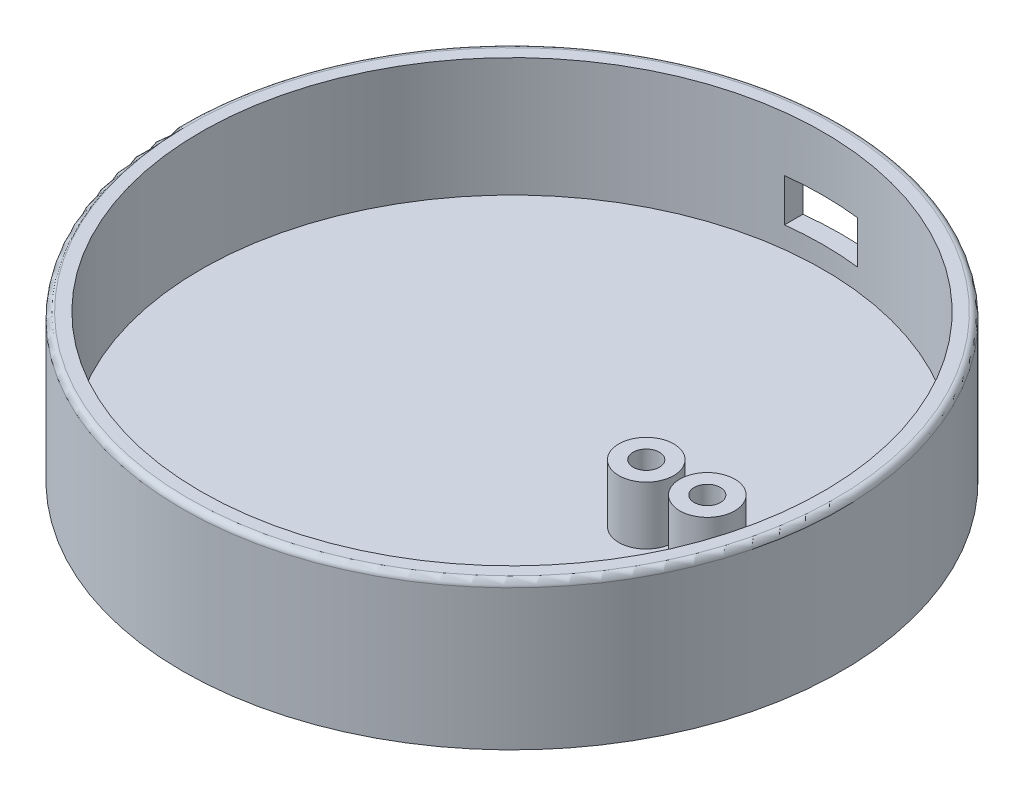
ISO-10303-21;
HEADER;
FILE_DESCRIPTION(('STEP AP214'),'2;1');
FILE_NAME('part.step','',(''),(''),'','','');
FILE_SCHEMA(('AUTOMOTIVE_DESIGN { 1 0 10303 214 1 1 1 1 }'));
ENDSEC;
DATA;
#1=APPLICATION_CONTEXT('core data for automotive mechanical design processes');
#2=APPLICATION_PROTOCOL_DEFINITION('international standard','automotive_design',2000,#1);
#3=PRODUCT_CONTEXT('',#1,'mechanical');
#4=PRODUCT('Part','Part','',(#3));
#5=PRODUCT_RELATED_PRODUCT_CATEGORY('part','',(#4));
#6=PRODUCT_DEFINITION_FORMATION('','',#4);
#7=PRODUCT_DEFINITION_CONTEXT('part definition',#1,'design');
#8=PRODUCT_DEFINITION('design','',#6,#7);
#9=PRODUCT_DEFINITION_SHAPE('','',#8);
#10=(LENGTH_UNIT() NAMED_UNIT(*) SI_UNIT(.MILLI.,.METRE.));
#11=(NAMED_UNIT(*) PLANE_ANGLE_UNIT() SI_UNIT($,.RADIAN.));
#12=(NAMED_UNIT(*) SI_UNIT($,.STERADIAN.) SOLID_ANGLE_UNIT());
#13=UNCERTAINTY_MEASURE_WITH_UNIT(LENGTH_MEASURE(1.E-05),#10,'distance_accuracy_value','');
#14=(GEOMETRIC_REPRESENTATION_CONTEXT(3) GLOBAL_UNCERTAINTY_ASSIGNED_CONTEXT((#13)) GLOBAL_UNIT_ASSIGNED_CONTEXT((#10,
#11,#12)) REPRESENTATION_CONTEXT('',''));
#15=CARTESIAN_POINT('',(0.,0.,0.));
#16=DIRECTION('',(0.,0.,1.));
#17=DIRECTION('',(1.,0.,0.));
#18=AXIS2_PLACEMENT_3D('',#15,#16,#17);
#19=CARTESIAN_POINT('',(0.,4.5,0.));
#20=DIRECTION('',(0.,-1.,0.));
#21=DIRECTION('',(0.,0.,-1.));
#22=AXIS2_PLACEMENT_3D('',#19,#20,#21);
#23=CYLINDRICAL_SURFACE('',#22,54.);
#24=CARTESIAN_POINT('',(0.,23.,0.));
#25=DIRECTION('',(0.,1.,0.));
#26=DIRECTION('',(0.,0.,1.));
#27=AXIS2_PLACEMENT_3D('',#24,#25,#26);
#28=CIRCLE('',#27,54.);
#29=CARTESIAN_POINT('',(0.,23.,54.));
#30=VERTEX_POINT('',#29);
#31=EDGE_CURVE('E11',#30,#30,#28,.F.);
#32=ORIENTED_EDGE('',*,*,#31,.T.);
#33=EDGE_LOOP('',(#32));
#34=FACE_BOUND('',#33,.T.);
#35=CARTESIAN_POINT('',(0.,0.,0.));
#36=DIRECTION('',(0.,1.,0.));
#37=DIRECTION('',(0.,0.,1.));
#38=AXIS2_PLACEMENT_3D('',#35,#36,#37);
#39=CIRCLE('',#38,54.);
#40=CARTESIAN_POINT('',(0.,0.,54.));
#41=VERTEX_POINT('',#40);
#42=EDGE_CURVE('E133',#41,#41,#39,.T.);
#43=ORIENTED_EDGE('',*,*,#42,.T.);
#44=EDGE_LOOP('',(#43));
#45=FACE_BOUND('',#44,.T.);
#46=CARTESIAN_POINT('',(0.,15.,0.));
#47=DIRECTION('',(0.,-1.,0.));
#48=DIRECTION('',(0.,0.,-1.));
#49=AXIS2_PLACEMENT_3D('',#46,#47,#48);
#50=CIRCLE('',#49,54.);
#51=CARTESIAN_POINT('',(-6.,15.,-53.6656314599949));
#52=VERTEX_POINT('',#51);
#53=CARTESIAN_POINT('',(6.,15.,-53.6656314599949));
#54=VERTEX_POINT('',#53);
#55=EDGE_CURVE('E84',#52,#54,#50,.T.);
#56=ORIENTED_EDGE('',*,*,#55,.F.);
#57=DIRECTION('',(0.,-1.,0.));
#58=VECTOR('',#57,1.);
#59=CARTESIAN_POINT('',(-6.,4.5,-53.6656314599949));
#60=LINE('',#59,#58);
#61=CARTESIAN_POINT('',(-6.,8.,-53.6656314599949));
#62=VERTEX_POINT('',#61);
#63=EDGE_CURVE('E90',#62,#52,#60,.F.);
#64=ORIENTED_EDGE('',*,*,#63,.F.);
#65=CARTESIAN_POINT('',(0.,8.,0.));
#66=DIRECTION('',(0.,-1.,0.));
#67=DIRECTION('',(0.,0.,-1.));
#68=AXIS2_PLACEMENT_3D('',#65,#66,#67);
#69=CIRCLE('',#68,54.);
#70=CARTESIAN_POINT('',(6.,8.,-53.6656314599949));
#71=VERTEX_POINT('',#70);
#72=EDGE_CURVE('E79',#62,#71,#69,.T.);
#73=ORIENTED_EDGE('',*,*,#72,.T.);
#74=DIRECTION('',(0.,-1.,0.));
#75=VECTOR('',#74,1.);
#76=CARTESIAN_POINT('',(6.,4.5,-53.6656314599949));
#77=LINE('',#76,#75);
#78=EDGE_CURVE('E98',#54,#71,#77,.T.);
#79=ORIENTED_EDGE('',*,*,#78,.F.);
#80=EDGE_LOOP('',(#56,#64,#73,#79));
#81=FACE_BOUND('',#80,.T.);
#82=ADVANCED_FACE('F41',(#34,#45,#81),#23,.T.);
#83=CARTESIAN_POINT('',(0.,24.,0.));
#84=DIRECTION('',(0.,-1.,0.));
#85=DIRECTION('',(0.,0.,-1.));
#86=AXIS2_PLACEMENT_3D('',#83,#84,#85);
#87=CYLINDRICAL_SURFACE('',#86,51.);
#88=CARTESIAN_POINT('',(0.,4.5,0.));
#89=DIRECTION('',(0.,1.,0.));
#90=DIRECTION('',(0.,0.,1.));
#91=AXIS2_PLACEMENT_3D('',#88,#89,#90);
#92=CIRCLE('',#91,51.);
#93=CARTESIAN_POINT('',(0.,4.5,51.));
#94=VERTEX_POINT('',#93);
#95=EDGE_CURVE('E134',#94,#94,#92,.F.);
#96=ORIENTED_EDGE('',*,*,#95,.T.);
#97=EDGE_LOOP('',(#96));
#98=FACE_BOUND('',#97,.T.);
#99=CARTESIAN_POINT('',(0.,24.,0.));
#100=DIRECTION('',(0.,1.,0.));
#101=DIRECTION('',(0.,0.,1.));
#102=AXIS2_PLACEMENT_3D('',#99,#100,#101);
#103=CIRCLE('',#102,51.);
#104=CARTESIAN_POINT('',(0.,24.,51.));
#105=VERTEX_POINT('',#104);
#106=EDGE_CURVE('E130',#105,#105,#103,.T.);
#107=ORIENTED_EDGE('',*,*,#106,.T.);
#108=EDGE_LOOP('',(#107));
#109=FACE_BOUND('',#108,.T.);
#110=DIRECTION('',(0.,-1.,0.));
#111=VECTOR('',#110,1.);
#112=CARTESIAN_POINT('',(-6.,24.,-50.6458290484024));
#113=LINE('',#112,#111);
#114=CARTESIAN_POINT('',(-6.,8.,-50.6458290484024));
#115=VERTEX_POINT('',#114);
#116=CARTESIAN_POINT('',(-6.,15.,-50.6458290484024));
#117=VERTEX_POINT('',#116);
#118=EDGE_CURVE('E93',#115,#117,#113,.F.);
#119=ORIENTED_EDGE('',*,*,#118,.T.);
#120=CARTESIAN_POINT('',(0.,15.,0.));
#121=DIRECTION('',(0.,-1.,0.));
#122=DIRECTION('',(0.,0.,-1.));
#123=AXIS2_PLACEMENT_3D('',#120,#121,#122);
#124=CIRCLE('',#123,51.);
#125=CARTESIAN_POINT('',(6.,15.,-50.6458290484024));
#126=VERTEX_POINT('',#125);
#127=EDGE_CURVE('E153',#117,#126,#124,.T.);
#128=ORIENTED_EDGE('',*,*,#127,.T.);
#129=DIRECTION('',(0.,-1.,0.));
#130=VECTOR('',#129,1.);
#131=CARTESIAN_POINT('',(6.,24.,-50.6458290484024));
#132=LINE('',#131,#130);
#133=CARTESIAN_POINT('',(6.,8.,-50.6458290484024));
#134=VERTEX_POINT('',#133);
#135=EDGE_CURVE('E149',#126,#134,#132,.T.);
#136=ORIENTED_EDGE('',*,*,#135,.T.);
#137=CARTESIAN_POINT('',(0.,8.,0.));
#138=DIRECTION('',(0.,-1.,0.));
#139=DIRECTION('',(0.,0.,-1.));
#140=AXIS2_PLACEMENT_3D('',#137,#138,#139);
#141=CIRCLE('',#140,51.);
#142=EDGE_CURVE('E137',#115,#134,#141,.T.);
#143=ORIENTED_EDGE('',*,*,#142,.F.);
#144=EDGE_LOOP('',(#119,#128,#136,#143));
#145=FACE_BOUND('',#144,.T.);
#146=ADVANCED_FACE('F170',(#98,#109,#145),#87,.F.);
#147=CARTESIAN_POINT('',(0.,0.,0.));
#148=DIRECTION('',(0.,1.,0.));
#149=DIRECTION('',(0.,0.,1.));
#150=AXIS2_PLACEMENT_3D('',#147,#148,#149);
#151=PLANE('',#150);
#152=CARTESIAN_POINT('',(22.,0.,0.));
#153=DIRECTION('',(0.,1.,0.));
#154=DIRECTION('',(0.,0.,1.));
#155=AXIS2_PLACEMENT_3D('',#152,#153,#154);
#156=CIRCLE('',#155,4.5);
#157=CARTESIAN_POINT('',(22.,0.,-4.5));
#158=VERTEX_POINT('',#157);
#159=EDGE_CURVE('E110',#158,#158,#156,.T.);
#160=ORIENTED_EDGE('',*,*,#159,.T.);
#161=EDGE_LOOP('',(#160));
#162=FACE_BOUND('',#161,.T.);
#163=CARTESIAN_POINT('',(32.,0.,0.));
#164=DIRECTION('',(0.,1.,0.));
#165=DIRECTION('',(0.,0.,1.));
#166=AXIS2_PLACEMENT_3D('',#163,#164,#165);
#167=CIRCLE('',#166,4.5);
#168=CARTESIAN_POINT('',(32.,0.,-4.5));
#169=VERTEX_POINT('',#168);
#170=EDGE_CURVE('E101',#169,#169,#167,.T.);
#171=ORIENTED_EDGE('',*,*,#170,.T.);
#172=EDGE_LOOP('',(#171));
#173=FACE_BOUND('',#172,.T.);
#174=ORIENTED_EDGE('',*,*,#42,.F.);
#175=EDGE_LOOP('',(#174));
#176=FACE_BOUND('',#175,.T.);
#177=ADVANCED_FACE('F175',(#162,#173,#176),#151,.F.);
#178=CARTESIAN_POINT('',(0.,24.,0.));
#179=DIRECTION('',(0.,1.,0.));
#180=DIRECTION('',(0.,0.,1.));
#181=AXIS2_PLACEMENT_3D('',#178,#179,#180);
#182=PLANE('',#181);
#183=CARTESIAN_POINT('',(0.,24.,0.));
#184=DIRECTION('',(0.,1.,0.));
#185=DIRECTION('',(0.,0.,1.));
#186=AXIS2_PLACEMENT_3D('',#183,#184,#185);
#187=CIRCLE('',#186,53.);
#188=CARTESIAN_POINT('',(0.,24.,53.));
#189=VERTEX_POINT('',#188);
#190=EDGE_CURVE('E49',#189,#189,#187,.T.);
#191=ORIENTED_EDGE('',*,*,#190,.T.);
#192=EDGE_LOOP('',(#191));
#193=FACE_BOUND('',#192,.T.);
#194=ORIENTED_EDGE('',*,*,#106,.F.);
#195=EDGE_LOOP('',(#194));
#196=FACE_BOUND('',#195,.T.);
#197=ADVANCED_FACE('F158',(#193,#196),#182,.T.);
#198=CARTESIAN_POINT('',(0.,4.5,0.));
#199=DIRECTION('',(0.,1.,0.));
#200=DIRECTION('',(0.,0.,1.));
#201=AXIS2_PLACEMENT_3D('',#198,#199,#200);
#202=PLANE('',#201);
#203=CARTESIAN_POINT('',(32.,4.5,0.));
#204=DIRECTION('',(0.,1.,0.));
#205=DIRECTION('',(0.,0.,1.));
#206=AXIS2_PLACEMENT_3D('',#203,#204,#205);
#207=CIRCLE('',#206,4.5);
#208=CARTESIAN_POINT('',(32.,4.5,4.5));
#209=VERTEX_POINT('',#208);
#210=EDGE_CURVE('E125',#209,#209,#207,.F.);
#211=ORIENTED_EDGE('',*,*,#210,.T.);
#212=EDGE_LOOP('',(#211));
#213=FACE_BOUND('',#212,.T.);
#214=CARTESIAN_POINT('',(22.,4.5,0.));
#215=DIRECTION('',(0.,1.,0.));
#216=DIRECTION('',(0.,0.,1.));
#217=AXIS2_PLACEMENT_3D('',#214,#215,#216);
#218=CIRCLE('',#217,4.5);
#219=CARTESIAN_POINT('',(22.,4.5,4.5));
#220=VERTEX_POINT('',#219);
#221=EDGE_CURVE('E129',#220,#220,#218,.F.);
#222=ORIENTED_EDGE('',*,*,#221,.T.);
#223=EDGE_LOOP('',(#222));
#224=FACE_BOUND('',#223,.T.);
#225=ORIENTED_EDGE('',*,*,#95,.F.);
#226=EDGE_LOOP('',(#225));
#227=FACE_BOUND('',#226,.T.);
#228=ADVANCED_FACE('F183',(#213,#224,#227),#202,.T.);
#229=CARTESIAN_POINT('',(22.,14.,0.));
#230=DIRECTION('',(0.,-1.,0.));
#231=DIRECTION('',(0.,0.,-1.));
#232=AXIS2_PLACEMENT_3D('',#229,#230,#231);
#233=CYLINDRICAL_SURFACE('',#232,4.5);
#234=ORIENTED_EDGE('',*,*,#221,.F.);
#235=EDGE_LOOP('',(#234));
#236=FACE_BOUND('',#235,.T.);
#237=CARTESIAN_POINT('',(22.,14.,0.));
#238=DIRECTION('',(0.,1.,0.));
#239=DIRECTION('',(0.,0.,1.));
#240=AXIS2_PLACEMENT_3D('',#237,#238,#239);
#241=CIRCLE('',#240,4.5);
#242=CARTESIAN_POINT('',(22.,14.,4.5));
#243=VERTEX_POINT('',#242);
#244=EDGE_CURVE('E126',#243,#243,#241,.T.);
#245=ORIENTED_EDGE('',*,*,#244,.F.);
#246=EDGE_LOOP('',(#245));
#247=FACE_BOUND('',#246,.T.);
#248=ADVANCED_FACE('F186',(#236,#247),#233,.T.);
#249=CARTESIAN_POINT('',(22.,14.,0.));
#250=DIRECTION('',(0.,1.,0.));
#251=DIRECTION('',(0.,0.,1.));
#252=AXIS2_PLACEMENT_3D('',#249,#250,#251);
#253=PLANE('',#252);
#254=CARTESIAN_POINT('',(22.,14.,0.));
#255=DIRECTION('',(0.,1.,0.));
#256=DIRECTION('',(0.,0.,1.));
#257=AXIS2_PLACEMENT_3D('',#254,#255,#256);
#258=CIRCLE('',#257,2.15);
#259=CARTESIAN_POINT('',(22.,14.,2.15));
#260=VERTEX_POINT('',#259);
#261=EDGE_CURVE('E115',#260,#260,#258,.T.);
#262=ORIENTED_EDGE('',*,*,#261,.F.);
#263=EDGE_LOOP('',(#262));
#264=FACE_BOUND('',#263,.T.);
#265=ORIENTED_EDGE('',*,*,#244,.T.);
#266=EDGE_LOOP('',(#265));
#267=FACE_BOUND('',#266,.T.);
#268=ADVANCED_FACE('F192',(#264,#267),#253,.T.);
#269=CARTESIAN_POINT('',(32.,14.,0.));
#270=DIRECTION('',(0.,-1.,0.));
#271=DIRECTION('',(0.,0.,-1.));
#272=AXIS2_PLACEMENT_3D('',#269,#270,#271);
#273=CYLINDRICAL_SURFACE('',#272,4.5);
#274=ORIENTED_EDGE('',*,*,#210,.F.);
#275=EDGE_LOOP('',(#274));
#276=FACE_BOUND('',#275,.T.);
#277=CARTESIAN_POINT('',(32.,14.,0.));
#278=DIRECTION('',(0.,1.,0.));
#279=DIRECTION('',(0.,0.,1.));
#280=AXIS2_PLACEMENT_3D('',#277,#278,#279);
#281=CIRCLE('',#280,4.5);
#282=CARTESIAN_POINT('',(32.,14.,4.5));
#283=VERTEX_POINT('',#282);
#284=EDGE_CURVE('E118',#283,#283,#281,.T.);
#285=ORIENTED_EDGE('',*,*,#284,.F.);
#286=EDGE_LOOP('',(#285));
#287=FACE_BOUND('',#286,.T.);
#288=ADVANCED_FACE('F196',(#276,#287),#273,.T.);
#289=CARTESIAN_POINT('',(32.,14.,0.));
#290=DIRECTION('',(0.,1.,0.));
#291=DIRECTION('',(0.,0.,1.));
#292=AXIS2_PLACEMENT_3D('',#289,#290,#291);
#293=PLANE('',#292);
#294=CARTESIAN_POINT('',(32.,14.,0.));
#295=DIRECTION('',(0.,1.,0.));
#296=DIRECTION('',(0.,0.,1.));
#297=AXIS2_PLACEMENT_3D('',#294,#295,#296);
#298=CIRCLE('',#297,2.15);
#299=CARTESIAN_POINT('',(32.,14.,2.15));
#300=VERTEX_POINT('',#299);
#301=EDGE_CURVE('E119',#300,#300,#298,.T.);
#302=ORIENTED_EDGE('',*,*,#301,.F.);
#303=EDGE_LOOP('',(#302));
#304=FACE_BOUND('',#303,.T.);
#305=ORIENTED_EDGE('',*,*,#284,.T.);
#306=EDGE_LOOP('',(#305));
#307=FACE_BOUND('',#306,.T.);
#308=ADVANCED_FACE('F198',(#304,#307),#293,.T.);
#309=CARTESIAN_POINT('',(32.,14.,0.));
#310=DIRECTION('',(0.,-1.,0.));
#311=DIRECTION('',(0.,0.,-1.));
#312=AXIS2_PLACEMENT_3D('',#309,#310,#311);
#313=CYLINDRICAL_SURFACE('',#312,2.15);
#314=CARTESIAN_POINT('',(32.,2.7,0.));
#315=DIRECTION('',(0.,1.,0.));
#316=DIRECTION('',(0.,0.,1.));
#317=AXIS2_PLACEMENT_3D('',#314,#315,#316);
#318=CIRCLE('',#317,2.15);
#319=CARTESIAN_POINT('',(32.,2.7,2.15));
#320=VERTEX_POINT('',#319);
#321=EDGE_CURVE('E122',#320,#320,#318,.T.);
#322=ORIENTED_EDGE('',*,*,#321,.F.);
#323=EDGE_LOOP('',(#322));
#324=FACE_BOUND('',#323,.T.);
#325=ORIENTED_EDGE('',*,*,#301,.T.);
#326=EDGE_LOOP('',(#325));
#327=FACE_BOUND('',#326,.T.);
#328=ADVANCED_FACE('F201',(#324,#327),#313,.F.);
#329=CARTESIAN_POINT('',(22.,14.,0.));
#330=DIRECTION('',(0.,-1.,0.));
#331=DIRECTION('',(0.,0.,-1.));
#332=AXIS2_PLACEMENT_3D('',#329,#330,#331);
#333=CYLINDRICAL_SURFACE('',#332,2.15);
#334=CARTESIAN_POINT('',(22.,2.7,0.));
#335=DIRECTION('',(0.,1.,0.));
#336=DIRECTION('',(0.,0.,1.));
#337=AXIS2_PLACEMENT_3D('',#334,#335,#336);
#338=CIRCLE('',#337,2.15);
#339=CARTESIAN_POINT('',(22.,2.7,2.15));
#340=VERTEX_POINT('',#339);
#341=EDGE_CURVE('E109',#340,#340,#338,.T.);
#342=ORIENTED_EDGE('',*,*,#341,.F.);
#343=EDGE_LOOP('',(#342));
#344=FACE_BOUND('',#343,.T.);
#345=ORIENTED_EDGE('',*,*,#261,.T.);
#346=EDGE_LOOP('',(#345));
#347=FACE_BOUND('',#346,.T.);
#348=ADVANCED_FACE('F208',(#344,#347),#333,.F.);
#349=CARTESIAN_POINT('',(22.,2.7,0.));
#350=DIRECTION('',(0.,-1.,0.));
#351=DIRECTION('',(0.,0.,-1.));
#352=AXIS2_PLACEMENT_3D('',#349,#350,#351);
#353=CYLINDRICAL_SURFACE('',#352,4.5);
#354=CARTESIAN_POINT('',(22.,2.7,0.));
#355=DIRECTION('',(0.,1.,0.));
#356=DIRECTION('',(0.,0.,1.));
#357=AXIS2_PLACEMENT_3D('',#354,#355,#356);
#358=CIRCLE('',#357,4.5);
#359=CARTESIAN_POINT('',(22.,2.7,-4.5));
#360=VERTEX_POINT('',#359);
#361=EDGE_CURVE('E106',#360,#360,#358,.T.);
#362=CARTESIAN_POINT('',(22.,2.7,-4.5));
#363=CARTESIAN_POINT('',(22.,2.671875,-4.5));
#364=CARTESIAN_POINT('',(22.,2.64375,-4.5));
#365=CARTESIAN_POINT('',(22.,2.5875,-4.5));
#366=CARTESIAN_POINT('',(22.,2.559375,-4.5));
#367=CARTESIAN_POINT('',(22.,2.503125,-4.5));
#368=CARTESIAN_POINT('',(22.,2.475,-4.5));
#369=CARTESIAN_POINT('',(22.,2.41875,-4.5));
#370=CARTESIAN_POINT('',(22.,2.390625,-4.5));
#371=CARTESIAN_POINT('',(22.,2.334375,-4.5));
#372=CARTESIAN_POINT('',(22.,2.30625,-4.5));
#373=CARTESIAN_POINT('',(22.,2.25,-4.5));
#374=CARTESIAN_POINT('',(22.,2.221875,-4.5));
#375=CARTESIAN_POINT('',(22.,2.165625,-4.5));
#376=CARTESIAN_POINT('',(22.,2.1375,-4.5));
#377=CARTESIAN_POINT('',(22.,2.08125,-4.5));
#378=CARTESIAN_POINT('',(22.,2.053125,-4.5));
#379=CARTESIAN_POINT('',(22.,1.996875,-4.5));
#380=CARTESIAN_POINT('',(22.,1.96875,-4.5));
#381=CARTESIAN_POINT('',(22.,1.9125,-4.5));
#382=CARTESIAN_POINT('',(22.,1.884375,-4.5));
#383=CARTESIAN_POINT('',(22.,1.828125,-4.5));
#384=CARTESIAN_POINT('',(22.,1.8,-4.5));
#385=CARTESIAN_POINT('',(22.,1.74375,-4.5));
#386=CARTESIAN_POINT('',(22.,1.715625,-4.5));
#387=CARTESIAN_POINT('',(22.,1.659375,-4.5));
#388=CARTESIAN_POINT('',(22.,1.63125,-4.5));
#389=CARTESIAN_POINT('',(22.,1.575,-4.5));
#390=CARTESIAN_POINT('',(22.,1.546875,-4.5));
#391=CARTESIAN_POINT('',(22.,1.490625,-4.5));
#392=CARTESIAN_POINT('',(22.,1.4625,-4.5));
#393=CARTESIAN_POINT('',(22.,1.40625,-4.5));
#394=CARTESIAN_POINT('',(22.,1.378125,-4.5));
#395=CARTESIAN_POINT('',(22.,1.321875,-4.5));
#396=CARTESIAN_POINT('',(22.,1.29375,-4.5));
#397=CARTESIAN_POINT('',(22.,1.2375,-4.5));
#398=CARTESIAN_POINT('',(22.,1.209375,-4.5));
#399=CARTESIAN_POINT('',(22.,1.153125,-4.5));
#400=CARTESIAN_POINT('',(22.,1.125,-4.5));
#401=CARTESIAN_POINT('',(22.,1.06875,-4.5));
#402=CARTESIAN_POINT('',(22.,1.040625,-4.5));
#403=CARTESIAN_POINT('',(22.,0.984375,-4.5));
#404=CARTESIAN_POINT('',(22.,0.956249999999999,-4.5));
#405=CARTESIAN_POINT('',(22.,0.899999999999999,-4.5));
#406=CARTESIAN_POINT('',(22.,0.871875,-4.5));
#407=CARTESIAN_POINT('',(22.,0.815624999999999,-4.5));
#408=CARTESIAN_POINT('',(22.,0.787499999999999,-4.5));
#409=CARTESIAN_POINT('',(22.,0.73125,-4.5));
#410=CARTESIAN_POINT('',(22.,0.703125,-4.5));
#411=CARTESIAN_POINT('',(22.,0.646875,-4.5));
#412=CARTESIAN_POINT('',(22.,0.61875,-4.5));
#413=CARTESIAN_POINT('',(22.,0.5625,-4.5));
#414=CARTESIAN_POINT('',(22.,0.534375,-4.5));
#415=CARTESIAN_POINT('',(22.,0.478125,-4.5));
#416=CARTESIAN_POINT('',(22.,0.45,-4.5));
#417=CARTESIAN_POINT('',(22.,0.39375,-4.5));
#418=CARTESIAN_POINT('',(22.,0.365625,-4.5));
#419=CARTESIAN_POINT('',(22.,0.309375,-4.5));
#420=CARTESIAN_POINT('',(22.,0.28125,-4.5));
#421=CARTESIAN_POINT('',(22.,0.225,-4.5));
#422=CARTESIAN_POINT('',(22.,0.196875,-4.5));
#423=CARTESIAN_POINT('',(22.,0.140625,-4.5));
#424=CARTESIAN_POINT('',(22.,0.1125,-4.5));
#425=CARTESIAN_POINT('',(22.,0.0562499999999997,-4.5));
#426=CARTESIAN_POINT('',(22.,0.0281249999999996,-4.5));
#427=CARTESIAN_POINT('',(22.,0.,-4.5));
#428=B_SPLINE_CURVE_WITH_KNOTS('',3,(#362,#363,#364,#365,#366,#367,#368,#369,#370,#371,#372,
#373,#374,#375,#376,#377,#378,#379,#380,#381,#382,#383,#384,#385,#386,#387,#388,#389,#390,#391,
#392,#393,#394,#395,#396,#397,#398,#399,#400,#401,#402,#403,#404,#405,#406,#407,#408,#409,#410,
#411,#412,#413,#414,#415,#416,#417,#418,#419,#420,#421,#422,#423,#424,#425,#426,#427),
.UNSPECIFIED.,.F.,.F.,(4,2,2,2,2,2,2,2,2,2,2,2,2,2,2,2,2,2,2,2,2,2,2,2,2,2,2,2,2,2,2,2,4),(0.,
0.0843750000000003,0.16875,0.253125,0.3375,0.421875,0.50625,0.590625,0.675,0.759375,0.84375,
0.928125000000001,1.0125,1.096875,1.18125,1.265625,1.35,1.434375,1.51875,1.603125,1.6875,
1.771875,1.85625,1.940625,2.025,2.109375,2.19375,2.278125,2.3625,2.446875,2.53125,2.615625,2.7),.UNSPECIFIED.);
#429=EDGE_CURVE('BSEAM212',#360,#158,#428,.T.);
#430=ORIENTED_EDGE('',*,*,#361,.T.);
#431=ORIENTED_EDGE('',*,*,#159,.F.);
#432=ORIENTED_EDGE('',*,*,#429,.T.);
#433=ORIENTED_EDGE('',*,*,#429,.F.);
#434=EDGE_LOOP('',(#430,#432,#431,#433));
#435=FACE_BOUND('',#434,.T.);
#436=ADVANCED_FACE('F212',(#435),#353,.F.);
#437=CARTESIAN_POINT('',(22.,2.7,0.));
#438=DIRECTION('',(0.,1.,0.));
#439=DIRECTION('',(0.,0.,1.));
#440=AXIS2_PLACEMENT_3D('',#437,#438,#439);
#441=PLANE('',#440);
#442=ORIENTED_EDGE('',*,*,#341,.T.);
#443=EDGE_LOOP('',(#442));
#444=FACE_BOUND('',#443,.T.);
#445=ORIENTED_EDGE('',*,*,#361,.F.);
#446=EDGE_LOOP('',(#445));
#447=FACE_BOUND('',#446,.T.);
#448=ADVANCED_FACE('F221',(#444,#447),#441,.F.);
#449=CARTESIAN_POINT('',(32.,2.7,0.));
#450=DIRECTION('',(0.,-1.,0.));
#451=DIRECTION('',(0.,0.,-1.));
#452=AXIS2_PLACEMENT_3D('',#449,#450,#451);
#453=CYLINDRICAL_SURFACE('',#452,4.5);
#454=CARTESIAN_POINT('',(32.,2.7,0.));
#455=DIRECTION('',(0.,1.,0.));
#456=DIRECTION('',(0.,0.,1.));
#457=AXIS2_PLACEMENT_3D('',#454,#455,#456);
#458=CIRCLE('',#457,4.5);
#459=CARTESIAN_POINT('',(32.,2.7,-4.5));
#460=VERTEX_POINT('',#459);
#461=EDGE_CURVE('E97',#460,#460,#458,.T.);
#462=CARTESIAN_POINT('',(32.,2.7,-4.5));
#463=CARTESIAN_POINT('',(32.,2.671875,-4.5));
#464=CARTESIAN_POINT('',(32.,2.64375,-4.5));
#465=CARTESIAN_POINT('',(32.,2.5875,-4.5));
#466=CARTESIAN_POINT('',(32.,2.559375,-4.5));
#467=CARTESIAN_POINT('',(32.,2.503125,-4.5));
#468=CARTESIAN_POINT('',(32.,2.475,-4.5));
#469=CARTESIAN_POINT('',(32.,2.41875,-4.5));
#470=CARTESIAN_POINT('',(32.,2.390625,-4.5));
#471=CARTESIAN_POINT('',(32.,2.334375,-4.5));
#472=CARTESIAN_POINT('',(32.,2.30625,-4.5));
#473=CARTESIAN_POINT('',(32.,2.25,-4.5));
#474=CARTESIAN_POINT('',(32.,2.221875,-4.5));
#475=CARTESIAN_POINT('',(32.,2.165625,-4.5));
#476=CARTESIAN_POINT('',(32.,2.1375,-4.5));
#477=CARTESIAN_POINT('',(32.,2.08125,-4.5));
#478=CARTESIAN_POINT('',(32.,2.053125,-4.5));
#479=CARTESIAN_POINT('',(32.,1.996875,-4.5));
#480=CARTESIAN_POINT('',(32.,1.96875,-4.5));
#481=CARTESIAN_POINT('',(32.,1.9125,-4.5));
#482=CARTESIAN_POINT('',(32.,1.884375,-4.5));
#483=CARTESIAN_POINT('',(32.,1.828125,-4.5));
#484=CARTESIAN_POINT('',(32.,1.8,-4.5));
#485=CARTESIAN_POINT('',(32.,1.74375,-4.5));
#486=CARTESIAN_POINT('',(32.,1.715625,-4.5));
#487=CARTESIAN_POINT('',(32.,1.659375,-4.5));
#488=CARTESIAN_POINT('',(32.,1.63125,-4.5));
#489=CARTESIAN_POINT('',(32.,1.575,-4.5));
#490=CARTESIAN_POINT('',(32.,1.546875,-4.5));
#491=CARTESIAN_POINT('',(32.,1.490625,-4.5));
#492=CARTESIAN_POINT('',(32.,1.4625,-4.5));
#493=CARTESIAN_POINT('',(32.,1.40625,-4.5));
#494=CARTESIAN_POINT('',(32.,1.378125,-4.5));
#495=CARTESIAN_POINT('',(32.,1.321875,-4.5));
#496=CARTESIAN_POINT('',(32.,1.29375,-4.5));
#497=CARTESIAN_POINT('',(32.,1.2375,-4.5));
#498=CARTESIAN_POINT('',(32.,1.209375,-4.5));
#499=CARTESIAN_POINT('',(32.,1.153125,-4.5));
#500=CARTESIAN_POINT('',(32.,1.125,-4.5));
#501=CARTESIAN_POINT('',(32.,1.06875,-4.5));
#502=CARTESIAN_POINT('',(32.,1.040625,-4.5));
#503=CARTESIAN_POINT('',(32.,0.984375,-4.5));
#504=CARTESIAN_POINT('',(32.,0.956249999999999,-4.5));
#505=CARTESIAN_POINT('',(32.,0.899999999999999,-4.5));
#506=CARTESIAN_POINT('',(32.,0.871875,-4.5));
#507=CARTESIAN_POINT('',(32.,0.815624999999999,-4.5));
#508=CARTESIAN_POINT('',(32.,0.787499999999999,-4.5));
#509=CARTESIAN_POINT('',(32.,0.73125,-4.5));
#510=CARTESIAN_POINT('',(32.,0.703125,-4.5));
#511=CARTESIAN_POINT('',(32.,0.646875,-4.5));
#512=CARTESIAN_POINT('',(32.,0.61875,-4.5));
#513=CARTESIAN_POINT('',(32.,0.5625,-4.5));
#514=CARTESIAN_POINT('',(32.,0.534375,-4.5));
#515=CARTESIAN_POINT('',(32.,0.478125,-4.5));
#516=CARTESIAN_POINT('',(32.,0.45,-4.5));
#517=CARTESIAN_POINT('',(32.,0.39375,-4.5));
#518=CARTESIAN_POINT('',(32.,0.365625,-4.5));
#519=CARTESIAN_POINT('',(32.,0.309375,-4.5));
#520=CARTESIAN_POINT('',(32.,0.28125,-4.5));
#521=CARTESIAN_POINT('',(32.,0.225,-4.5));
#522=CARTESIAN_POINT('',(32.,0.196875,-4.5));
#523=CARTESIAN_POINT('',(32.,0.140625,-4.5));
#524=CARTESIAN_POINT('',(32.,0.1125,-4.5));
#525=CARTESIAN_POINT('',(32.,0.0562499999999997,-4.5));
#526=CARTESIAN_POINT('',(32.,0.0281249999999996,-4.5));
#527=CARTESIAN_POINT('',(32.,0.,-4.5));
#528=B_SPLINE_CURVE_WITH_KNOTS('',3,(#462,#463,#464,#465,#466,#467,#468,#469,#470,#471,#472,
#473,#474,#475,#476,#477,#478,#479,#480,#481,#482,#483,#484,#485,#486,#487,#488,#489,#490,#491,
#492,#493,#494,#495,#496,#497,#498,#499,#500,#501,#502,#503,#504,#505,#506,#507,#508,#509,#510,
#511,#512,#513,#514,#515,#516,#517,#518,#519,#520,#521,#522,#523,#524,#525,#526,#527),
.UNSPECIFIED.,.F.,.F.,(4,2,2,2,2,2,2,2,2,2,2,2,2,2,2,2,2,2,2,2,2,2,2,2,2,2,2,2,2,2,2,2,4),(0.,
0.0843750000000003,0.16875,0.253125,0.3375,0.421875,0.50625,0.590625,0.675,0.759375,0.84375,
0.928125000000001,1.0125,1.096875,1.18125,1.265625,1.35,1.434375,1.51875,1.603125,1.6875,
1.771875,1.85625,1.940625,2.025,2.109375,2.19375,2.278125,2.3625,2.446875,2.53125,2.615625,2.7),.UNSPECIFIED.);
#529=EDGE_CURVE('BSEAM217',#460,#169,#528,.T.);
#530=ORIENTED_EDGE('',*,*,#461,.T.);
#531=ORIENTED_EDGE('',*,*,#170,.F.);
#532=ORIENTED_EDGE('',*,*,#529,.T.);
#533=ORIENTED_EDGE('',*,*,#529,.F.);
#534=EDGE_LOOP('',(#530,#532,#531,#533));
#535=FACE_BOUND('',#534,.T.);
#536=ADVANCED_FACE('F217',(#535),#453,.F.);
#537=CARTESIAN_POINT('',(32.,2.7,0.));
#538=DIRECTION('',(0.,1.,0.));
#539=DIRECTION('',(0.,0.,1.));
#540=AXIS2_PLACEMENT_3D('',#537,#538,#539);
#541=PLANE('',#540);
#542=ORIENTED_EDGE('',*,*,#321,.T.);
#543=EDGE_LOOP('',(#542));
#544=FACE_BOUND('',#543,.T.);
#545=ORIENTED_EDGE('',*,*,#461,.F.);
#546=EDGE_LOOP('',(#545));
#547=FACE_BOUND('',#546,.T.);
#548=ADVANCED_FACE('F214',(#544,#547),#541,.F.);
#549=CARTESIAN_POINT('',(-6.,15.,-49.));
#550=DIRECTION('',(1.,0.,0.));
#551=DIRECTION('',(0.,0.,-1.));
#552=AXIS2_PLACEMENT_3D('',#549,#550,#551);
#553=PLANE('',#552);
#554=ORIENTED_EDGE('',*,*,#63,.T.);
#555=DIRECTION('',(0.,0.,1.));
#556=VECTOR('',#555,1.);
#557=CARTESIAN_POINT('',(-6.,15.,-49.));
#558=LINE('',#557,#556);
#559=EDGE_CURVE('E241',#52,#117,#558,.T.);
#560=ORIENTED_EDGE('',*,*,#559,.T.);
#561=ORIENTED_EDGE('',*,*,#118,.F.);
#562=DIRECTION('',(0.,0.,1.));
#563=VECTOR('',#562,1.);
#564=CARTESIAN_POINT('',(-6.,8.,-49.));
#565=LINE('',#564,#563);
#566=EDGE_CURVE('E61',#62,#115,#565,.T.);
#567=ORIENTED_EDGE('',*,*,#566,.F.);
#568=EDGE_LOOP('',(#554,#560,#561,#567));
#569=FACE_BOUND('',#568,.T.);
#570=ADVANCED_FACE('F88',(#569),#553,.T.);
#571=CARTESIAN_POINT('',(6.,15.,-49.));
#572=DIRECTION('',(-1.,0.,0.));
#573=DIRECTION('',(0.,0.,1.));
#574=AXIS2_PLACEMENT_3D('',#571,#572,#573);
#575=PLANE('',#574);
#576=ORIENTED_EDGE('',*,*,#78,.T.);
#577=DIRECTION('',(0.,0.,-1.));
#578=VECTOR('',#577,1.);
#579=CARTESIAN_POINT('',(6.,8.,-49.));
#580=LINE('',#579,#578);
#581=EDGE_CURVE('E56',#134,#71,#580,.T.);
#582=ORIENTED_EDGE('',*,*,#581,.F.);
#583=ORIENTED_EDGE('',*,*,#135,.F.);
#584=DIRECTION('',(0.,0.,-1.));
#585=VECTOR('',#584,1.);
#586=CARTESIAN_POINT('',(6.,15.,-49.));
#587=LINE('',#586,#585);
#588=EDGE_CURVE('E85',#126,#54,#587,.T.);
#589=ORIENTED_EDGE('',*,*,#588,.T.);
#590=EDGE_LOOP('',(#576,#582,#583,#589));
#591=FACE_BOUND('',#590,.T.);
#592=ADVANCED_FACE('F231',(#591),#575,.T.);
#593=CARTESIAN_POINT('',(0.,15.,0.));
#594=DIRECTION('',(0.,-1.,0.));
#595=DIRECTION('',(0.,0.,-1.));
#596=AXIS2_PLACEMENT_3D('',#593,#594,#595);
#597=PLANE('',#596);
#598=ORIENTED_EDGE('',*,*,#55,.T.);
#599=ORIENTED_EDGE('',*,*,#588,.F.);
#600=ORIENTED_EDGE('',*,*,#127,.F.);
#601=ORIENTED_EDGE('',*,*,#559,.F.);
#602=EDGE_LOOP('',(#598,#599,#600,#601));
#603=FACE_BOUND('',#602,.T.);
#604=ADVANCED_FACE('F166',(#603),#597,.T.);
#605=CARTESIAN_POINT('',(0.,8.,0.));
#606=DIRECTION('',(0.,-1.,0.));
#607=DIRECTION('',(0.,0.,-1.));
#608=AXIS2_PLACEMENT_3D('',#605,#606,#607);
#609=PLANE('',#608);
#610=ORIENTED_EDGE('',*,*,#566,.T.);
#611=ORIENTED_EDGE('',*,*,#142,.T.);
#612=ORIENTED_EDGE('',*,*,#581,.T.);
#613=ORIENTED_EDGE('',*,*,#72,.F.);
#614=EDGE_LOOP('',(#610,#611,#612,#613));
#615=FACE_BOUND('',#614,.T.);
#616=ADVANCED_FACE('F80',(#615),#609,.F.);
#617=CARTESIAN_POINT('',(0.,23.,0.));
#618=DIRECTION('',(0.,1.,0.));
#619=DIRECTION('',(0.,0.,1.));
#620=AXIS2_PLACEMENT_3D('',#617,#618,#619);
#621=TOROIDAL_SURFACE('',#620,53.,1.);
#622=ORIENTED_EDGE('',*,*,#31,.F.);
#623=EDGE_LOOP('',(#622));
#624=FACE_BOUND('',#623,.T.);
#625=ORIENTED_EDGE('',*,*,#190,.F.);
#626=EDGE_LOOP('',(#625));
#627=FACE_BOUND('',#626,.T.);
#628=ADVANCED_FACE('F43',(#624,#627),#621,.T.);
#629=CLOSED_SHELL('',(#82,#146,#177,#197,#228,#248,#268,#288,#308,#328,#348,#436,#448,#536,#548,
#570,#592,#604,#616,#628));
#630=MANIFOLD_SOLID_BREP('B2',#629);
#631=ADVANCED_BREP_SHAPE_REPRESENTATION('',(#18,#630),#14);
#632=SHAPE_DEFINITION_REPRESENTATION(#9,#631);
ENDSEC;
END-ISO-10303-21;
